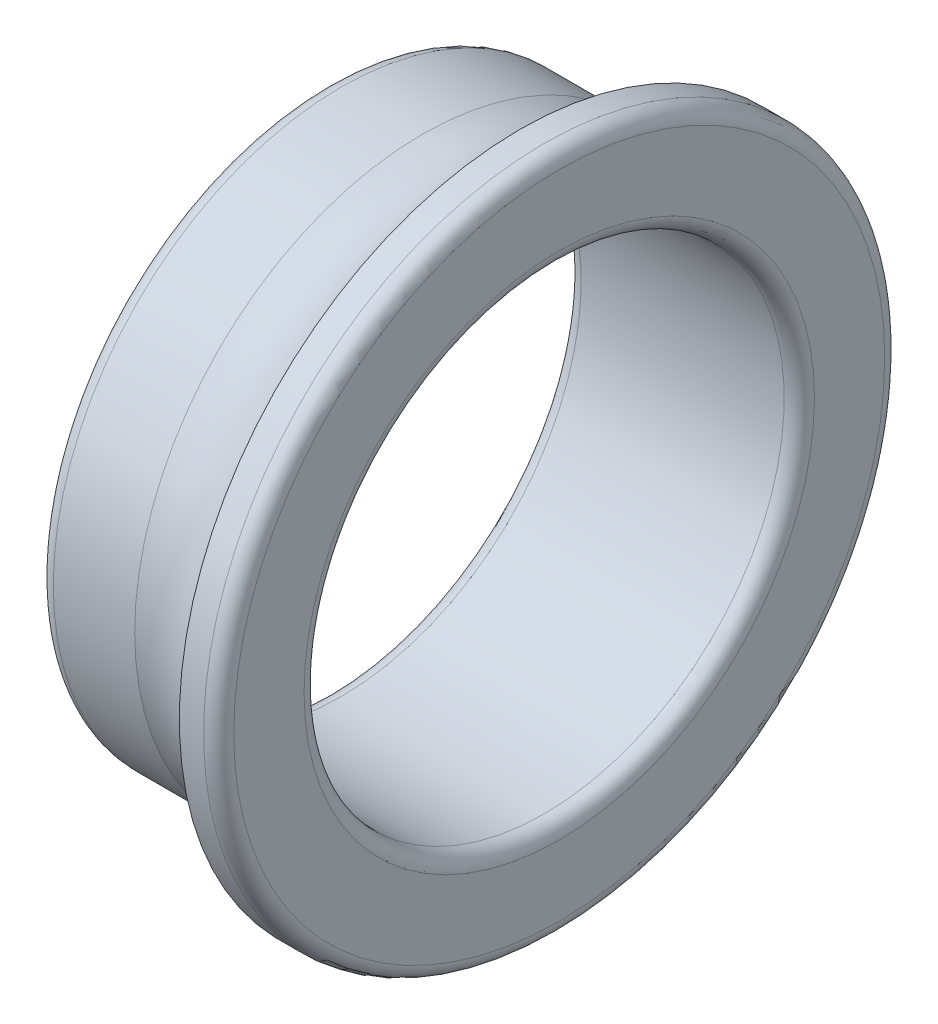
ISO-10303-21;
HEADER;
FILE_DESCRIPTION(('STEP AP214'),'2;1');
FILE_NAME('part.step','',(''),(''),'','','');
FILE_SCHEMA(('AUTOMOTIVE_DESIGN { 1 0 10303 214 1 1 1 1 }'));
ENDSEC;
DATA;
#1=APPLICATION_CONTEXT('core data for automotive mechanical design processes');
#2=APPLICATION_PROTOCOL_DEFINITION('international standard','automotive_design',2000,#1);
#3=PRODUCT_CONTEXT('',#1,'mechanical');
#4=PRODUCT('Part','Part','',(#3));
#5=PRODUCT_RELATED_PRODUCT_CATEGORY('part','',(#4));
#6=PRODUCT_DEFINITION_FORMATION('','',#4);
#7=PRODUCT_DEFINITION_CONTEXT('part definition',#1,'design');
#8=PRODUCT_DEFINITION('design','',#6,#7);
#9=PRODUCT_DEFINITION_SHAPE('','',#8);
#10=(LENGTH_UNIT() NAMED_UNIT(*) SI_UNIT(.MILLI.,.METRE.));
#11=(NAMED_UNIT(*) PLANE_ANGLE_UNIT() SI_UNIT($,.RADIAN.));
#12=(NAMED_UNIT(*) SI_UNIT($,.STERADIAN.) SOLID_ANGLE_UNIT());
#13=UNCERTAINTY_MEASURE_WITH_UNIT(LENGTH_MEASURE(1.E-05),#10,'distance_accuracy_value','');
#14=(GEOMETRIC_REPRESENTATION_CONTEXT(3) GLOBAL_UNCERTAINTY_ASSIGNED_CONTEXT((#13)) GLOBAL_UNIT_ASSIGNED_CONTEXT((#10,
#11,#12)) REPRESENTATION_CONTEXT('',''));
#15=CARTESIAN_POINT('',(0.,0.,0.));
#16=DIRECTION('',(0.,0.,1.));
#17=DIRECTION('',(1.,0.,0.));
#18=AXIS2_PLACEMENT_3D('',#15,#16,#17);
#19=CARTESIAN_POINT('',(15.9,0.,0.));
#20=DIRECTION('',(1.,0.,0.));
#21=DIRECTION('',(0.,0.,-1.));
#22=AXIS2_PLACEMENT_3D('',#19,#20,#21);
#23=TOROIDAL_SURFACE('',#22,18.6,1.1);
#24=CARTESIAN_POINT('',(17.,0.,0.));
#25=DIRECTION('',(1.,0.,0.));
#26=DIRECTION('',(0.,1.,0.));
#27=AXIS2_PLACEMENT_3D('',#24,#25,#26);
#28=CIRCLE('',#27,18.6);
#29=CARTESIAN_POINT('',(17.,18.6,0.));
#30=VERTEX_POINT('',#29);
#31=EDGE_CURVE('E11',#30,#30,#28,.T.);
#32=ORIENTED_EDGE('',*,*,#31,.T.);
#33=EDGE_LOOP('',(#32));
#34=FACE_BOUND('',#33,.T.);
#35=CARTESIAN_POINT('',(15.9,0.,0.));
#36=DIRECTION('',(1.,0.,0.));
#37=DIRECTION('',(0.,1.,0.));
#38=AXIS2_PLACEMENT_3D('',#35,#36,#37);
#39=CIRCLE('',#38,17.5);
#40=CARTESIAN_POINT('',(15.9,17.5,0.));
#41=VERTEX_POINT('',#40);
#42=EDGE_CURVE('E20',#41,#41,#39,.T.);
#43=ORIENTED_EDGE('',*,*,#42,.F.);
#44=EDGE_LOOP('',(#43));
#45=FACE_BOUND('',#44,.T.);
#46=ADVANCED_FACE('F16',(#34,#45),#23,.T.);
#47=CARTESIAN_POINT('',(17.,21.1625,0.));
#48=DIRECTION('',(1.,0.,0.));
#49=DIRECTION('',(0.,1.,0.));
#50=AXIS2_PLACEMENT_3D('',#47,#48,#49);
#51=PLANE('',#50);
#52=CARTESIAN_POINT('',(17.,0.,0.));
#53=DIRECTION('',(1.,0.,0.));
#54=DIRECTION('',(0.,1.,0.));
#55=AXIS2_PLACEMENT_3D('',#52,#53,#54);
#56=CIRCLE('',#55,23.725);
#57=CARTESIAN_POINT('',(17.,23.725,0.));
#58=VERTEX_POINT('',#57);
#59=EDGE_CURVE('E26',#58,#58,#56,.T.);
#60=ORIENTED_EDGE('',*,*,#59,.T.);
#61=EDGE_LOOP('',(#60));
#62=FACE_BOUND('',#61,.T.);
#63=ORIENTED_EDGE('',*,*,#31,.F.);
#64=EDGE_LOOP('',(#63));
#65=FACE_BOUND('',#64,.T.);
#66=ADVANCED_FACE('F84',(#62,#65),#51,.T.);
#67=CARTESIAN_POINT('',(15.9,0.,0.));
#68=DIRECTION('',(1.,0.,0.));
#69=DIRECTION('',(0.,0.,-1.));
#70=AXIS2_PLACEMENT_3D('',#67,#68,#69);
#71=TOROIDAL_SURFACE('',#70,23.725,1.1);
#72=CARTESIAN_POINT('',(15.9,0.,0.));
#73=DIRECTION('',(1.,0.,0.));
#74=DIRECTION('',(0.,1.,0.));
#75=AXIS2_PLACEMENT_3D('',#72,#73,#74);
#76=CIRCLE('',#75,24.825);
#77=CARTESIAN_POINT('',(15.9,24.825,0.));
#78=VERTEX_POINT('',#77);
#79=EDGE_CURVE('E105',#78,#78,#76,.T.);
#80=ORIENTED_EDGE('',*,*,#79,.T.);
#81=EDGE_LOOP('',(#80));
#82=FACE_BOUND('',#81,.T.);
#83=ORIENTED_EDGE('',*,*,#59,.F.);
#84=EDGE_LOOP('',(#83));
#85=FACE_BOUND('',#84,.T.);
#86=ADVANCED_FACE('F90',(#82,#85),#71,.T.);
#87=CARTESIAN_POINT('',(15.016584101354,0.,0.));
#88=DIRECTION('',(-1.,0.,0.));
#89=DIRECTION('',(0.,1.,0.));
#90=AXIS2_PLACEMENT_3D('',#87,#88,#89);
#91=CYLINDRICAL_SURFACE('',#90,24.825);
#92=CARTESIAN_POINT('',(14.133168202708,0.,0.));
#93=DIRECTION('',(1.,0.,0.));
#94=DIRECTION('',(0.,1.,0.));
#95=AXIS2_PLACEMENT_3D('',#92,#93,#94);
#96=CIRCLE('',#95,24.825);
#97=CARTESIAN_POINT('',(14.133168202708,24.825,0.));
#98=VERTEX_POINT('',#97);
#99=EDGE_CURVE('E47',#98,#98,#96,.T.);
#100=ORIENTED_EDGE('',*,*,#99,.T.);
#101=EDGE_LOOP('',(#100));
#102=FACE_BOUND('',#101,.T.);
#103=ORIENTED_EDGE('',*,*,#79,.F.);
#104=EDGE_LOOP('',(#103));
#105=FACE_BOUND('',#104,.T.);
#106=ADVANCED_FACE('F94',(#102,#105),#91,.T.);
#107=CARTESIAN_POINT('',(8.5,0.,0.));
#108=DIRECTION('',(1.,0.,0.));
#109=DIRECTION('',(0.,0.,-1.));
#110=AXIS2_PLACEMENT_3D('',#107,#108,#109);
#111=TOROIDAL_SURFACE('',#110,26.75,5.953);
#112=CARTESIAN_POINT('',(7.03531266135052,0.,0.));
#113=DIRECTION('',(1.,0.,0.));
#114=DIRECTION('',(0.,1.,0.));
#115=AXIS2_PLACEMENT_3D('',#112,#113,#114);
#116=CIRCLE('',#115,20.98);
#117=CARTESIAN_POINT('',(7.03531266135052,20.98,0.));
#118=VERTEX_POINT('',#117);
#119=EDGE_CURVE('E55',#118,#118,#116,.T.);
#120=ORIENTED_EDGE('',*,*,#119,.T.);
#121=EDGE_LOOP('',(#120));
#122=FACE_BOUND('',#121,.T.);
#123=ORIENTED_EDGE('',*,*,#99,.F.);
#124=EDGE_LOOP('',(#123));
#125=FACE_BOUND('',#124,.T.);
#126=ADVANCED_FACE('F95',(#122,#125),#111,.F.);
#127=CARTESIAN_POINT('',(4.06765633067527,0.,0.));
#128=DIRECTION('',(-1.,0.,0.));
#129=DIRECTION('',(0.,1.,0.));
#130=AXIS2_PLACEMENT_3D('',#127,#128,#129);
#131=CYLINDRICAL_SURFACE('',#130,20.98);
#132=CARTESIAN_POINT('',(1.1,0.,0.));
#133=DIRECTION('',(1.,0.,0.));
#134=DIRECTION('',(0.,1.,0.));
#135=AXIS2_PLACEMENT_3D('',#132,#133,#134);
#136=CIRCLE('',#135,20.98);
#137=CARTESIAN_POINT('',(1.1,20.98,0.));
#138=VERTEX_POINT('',#137);
#139=EDGE_CURVE('E69',#138,#138,#136,.T.);
#140=ORIENTED_EDGE('',*,*,#139,.T.);
#141=EDGE_LOOP('',(#140));
#142=FACE_BOUND('',#141,.T.);
#143=ORIENTED_EDGE('',*,*,#119,.F.);
#144=EDGE_LOOP('',(#143));
#145=FACE_BOUND('',#144,.T.);
#146=ADVANCED_FACE('F97',(#142,#145),#131,.T.);
#147=CARTESIAN_POINT('',(1.1,0.,0.));
#148=DIRECTION('',(1.,0.,0.));
#149=DIRECTION('',(0.,0.,-1.));
#150=AXIS2_PLACEMENT_3D('',#147,#148,#149);
#151=TOROIDAL_SURFACE('',#150,19.88,1.1);
#152=CARTESIAN_POINT('',(0.,0.,0.));
#153=DIRECTION('',(1.,0.,0.));
#154=DIRECTION('',(0.,1.,0.));
#155=AXIS2_PLACEMENT_3D('',#152,#153,#154);
#156=CIRCLE('',#155,19.88);
#157=CARTESIAN_POINT('',(0.,19.88,0.));
#158=VERTEX_POINT('',#157);
#159=EDGE_CURVE('E65',#158,#158,#156,.T.);
#160=ORIENTED_EDGE('',*,*,#159,.T.);
#161=EDGE_LOOP('',(#160));
#162=FACE_BOUND('',#161,.T.);
#163=ORIENTED_EDGE('',*,*,#139,.F.);
#164=EDGE_LOOP('',(#163));
#165=FACE_BOUND('',#164,.T.);
#166=ADVANCED_FACE('F66',(#162,#165),#151,.T.);
#167=CARTESIAN_POINT('',(0.,19.24,0.));
#168=DIRECTION('',(-1.,0.,0.));
#169=DIRECTION('',(0.,-1.,0.));
#170=AXIS2_PLACEMENT_3D('',#167,#168,#169);
#171=PLANE('',#170);
#172=CARTESIAN_POINT('',(0.,0.,0.));
#173=DIRECTION('',(1.,0.,0.));
#174=DIRECTION('',(0.,1.,0.));
#175=AXIS2_PLACEMENT_3D('',#172,#173,#174);
#176=CIRCLE('',#175,18.6);
#177=CARTESIAN_POINT('',(0.,18.6,0.));
#178=VERTEX_POINT('',#177);
#179=EDGE_CURVE('E61',#178,#178,#176,.T.);
#180=ORIENTED_EDGE('',*,*,#179,.T.);
#181=EDGE_LOOP('',(#180));
#182=FACE_BOUND('',#181,.T.);
#183=ORIENTED_EDGE('',*,*,#159,.F.);
#184=EDGE_LOOP('',(#183));
#185=FACE_BOUND('',#184,.T.);
#186=ADVANCED_FACE('F118',(#182,#185),#171,.T.);
#187=CARTESIAN_POINT('',(1.1,0.,0.));
#188=DIRECTION('',(1.,0.,0.));
#189=DIRECTION('',(0.,0.,-1.));
#190=AXIS2_PLACEMENT_3D('',#187,#188,#189);
#191=TOROIDAL_SURFACE('',#190,18.6,1.1);
#192=CARTESIAN_POINT('',(1.1,0.,0.));
#193=DIRECTION('',(1.,0.,0.));
#194=DIRECTION('',(0.,1.,0.));
#195=AXIS2_PLACEMENT_3D('',#192,#193,#194);
#196=CIRCLE('',#195,17.5);
#197=CARTESIAN_POINT('',(1.1,17.5,0.));
#198=VERTEX_POINT('',#197);
#199=EDGE_CURVE('E74',#198,#198,#196,.T.);
#200=ORIENTED_EDGE('',*,*,#199,.T.);
#201=EDGE_LOOP('',(#200));
#202=FACE_BOUND('',#201,.T.);
#203=ORIENTED_EDGE('',*,*,#179,.F.);
#204=EDGE_LOOP('',(#203));
#205=FACE_BOUND('',#204,.T.);
#206=ADVANCED_FACE('F18',(#202,#205),#191,.T.);
#207=CARTESIAN_POINT('',(8.5,0.,0.));
#208=DIRECTION('',(-1.,0.,0.));
#209=DIRECTION('',(0.,1.,0.));
#210=AXIS2_PLACEMENT_3D('',#207,#208,#209);
#211=CYLINDRICAL_SURFACE('',#210,17.5);
#212=ORIENTED_EDGE('',*,*,#42,.T.);
#213=EDGE_LOOP('',(#212));
#214=FACE_BOUND('',#213,.T.);
#215=ORIENTED_EDGE('',*,*,#199,.F.);
#216=EDGE_LOOP('',(#215));
#217=FACE_BOUND('',#216,.T.);
#218=ADVANCED_FACE('F80',(#214,#217),#211,.F.);
#219=CLOSED_SHELL('',(#46,#66,#86,#106,#126,#146,#166,#186,#206,#218));
#220=MANIFOLD_SOLID_BREP('B1',#219);
#221=ADVANCED_BREP_SHAPE_REPRESENTATION('',(#18,#220),#14);
#222=SHAPE_DEFINITION_REPRESENTATION(#9,#221);
ENDSEC;
END-ISO-10303-21;
